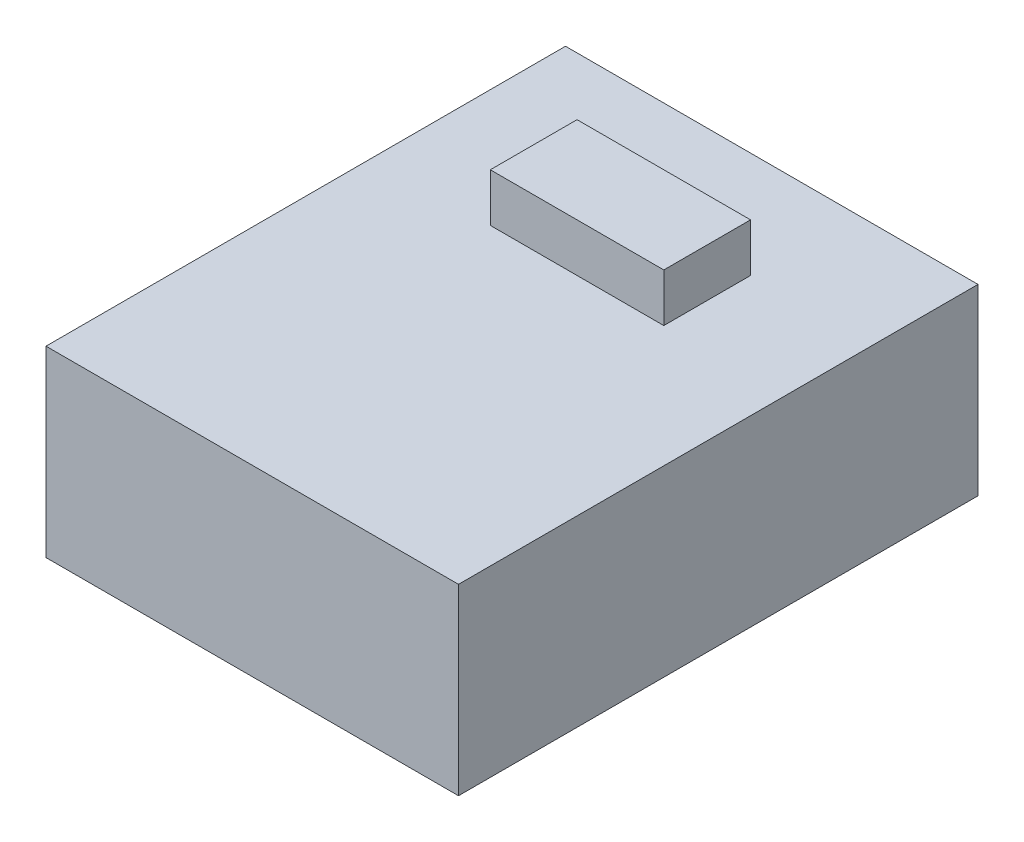
ISO-10303-21;
HEADER;
FILE_DESCRIPTION(('STEP AP214'),'2;1');
FILE_NAME('part.step','',(''),(''),'','','');
FILE_SCHEMA(('AUTOMOTIVE_DESIGN { 1 0 10303 214 1 1 1 1 }'));
ENDSEC;
DATA;
#1=APPLICATION_CONTEXT('core data for automotive mechanical design processes');
#2=APPLICATION_PROTOCOL_DEFINITION('international standard','automotive_design',2000,#1);
#3=PRODUCT_CONTEXT('',#1,'mechanical');
#4=PRODUCT('Part','Part','',(#3));
#5=PRODUCT_RELATED_PRODUCT_CATEGORY('part','',(#4));
#6=PRODUCT_DEFINITION_FORMATION('','',#4);
#7=PRODUCT_DEFINITION_CONTEXT('part definition',#1,'design');
#8=PRODUCT_DEFINITION('design','',#6,#7);
#9=PRODUCT_DEFINITION_SHAPE('','',#8);
#10=(LENGTH_UNIT() NAMED_UNIT(*) SI_UNIT(.MILLI.,.METRE.));
#11=(NAMED_UNIT(*) PLANE_ANGLE_UNIT() SI_UNIT($,.RADIAN.));
#12=(NAMED_UNIT(*) SI_UNIT($,.STERADIAN.) SOLID_ANGLE_UNIT());
#13=UNCERTAINTY_MEASURE_WITH_UNIT(LENGTH_MEASURE(1.E-05),#10,'distance_accuracy_value','');
#14=(GEOMETRIC_REPRESENTATION_CONTEXT(3) GLOBAL_UNCERTAINTY_ASSIGNED_CONTEXT((#13)) GLOBAL_UNIT_ASSIGNED_CONTEXT((#10,
#11,#12)) REPRESENTATION_CONTEXT('',''));
#15=CARTESIAN_POINT('',(0.,0.,0.));
#16=DIRECTION('',(0.,0.,1.));
#17=DIRECTION('',(1.,0.,0.));
#18=AXIS2_PLACEMENT_3D('',#15,#16,#17);
#19=CARTESIAN_POINT('',(0.,19.,0.));
#20=DIRECTION('',(0.,-1.,0.));
#21=DIRECTION('',(0.,0.,-1.));
#22=AXIS2_PLACEMENT_3D('',#19,#20,#21);
#23=PLANE('',#22);
#24=DIRECTION('',(0.,0.,1.));
#25=VECTOR('',#24,1.);
#26=CARTESIAN_POINT('',(0.,19.,0.));
#27=LINE('',#26,#25);
#28=CARTESIAN_POINT('',(0.,19.,-53.9));
#29=VERTEX_POINT('',#28);
#30=CARTESIAN_POINT('',(0.,19.,0.));
#31=VERTEX_POINT('',#30);
#32=EDGE_CURVE('E129',#29,#31,#27,.T.);
#33=ORIENTED_EDGE('',*,*,#32,.T.);
#34=DIRECTION('',(1.,0.,0.));
#35=VECTOR('',#34,1.);
#36=CARTESIAN_POINT('',(0.,19.,0.));
#37=LINE('',#36,#35);
#38=CARTESIAN_POINT('',(42.8,19.,0.));
#39=VERTEX_POINT('',#38);
#40=EDGE_CURVE('E132',#31,#39,#37,.T.);
#41=ORIENTED_EDGE('',*,*,#40,.T.);
#42=DIRECTION('',(0.,0.,-1.));
#43=VECTOR('',#42,1.);
#44=CARTESIAN_POINT('',(42.8,19.,0.));
#45=LINE('',#44,#43);
#46=CARTESIAN_POINT('',(42.8,19.,-53.9));
#47=VERTEX_POINT('',#46);
#48=EDGE_CURVE('E135',#39,#47,#45,.T.);
#49=ORIENTED_EDGE('',*,*,#48,.T.);
#50=DIRECTION('',(-1.,0.,0.));
#51=VECTOR('',#50,1.);
#52=CARTESIAN_POINT('',(0.,19.,-53.9));
#53=LINE('',#52,#51);
#54=EDGE_CURVE('E137',#47,#29,#53,.T.);
#55=ORIENTED_EDGE('',*,*,#54,.T.);
#56=EDGE_LOOP('',(#33,#41,#49,#55));
#57=FACE_BOUND('',#56,.T.);
#58=DIRECTION('',(0.,0.,1.));
#59=VECTOR('',#58,1.);
#60=CARTESIAN_POINT('',(12.2,19.,-42.9));
#61=LINE('',#60,#59);
#62=CARTESIAN_POINT('',(12.2,19.,-42.9));
#63=VERTEX_POINT('',#62);
#64=CARTESIAN_POINT('',(12.2,19.,-33.9));
#65=VERTEX_POINT('',#64);
#66=EDGE_CURVE('E119',#63,#65,#61,.T.);
#67=ORIENTED_EDGE('',*,*,#66,.F.);
#68=DIRECTION('',(-1.,0.,0.));
#69=VECTOR('',#68,1.);
#70=CARTESIAN_POINT('',(12.2,19.,-42.9));
#71=LINE('',#70,#69);
#72=CARTESIAN_POINT('',(30.2,19.,-42.9));
#73=VERTEX_POINT('',#72);
#74=EDGE_CURVE('E116',#73,#63,#71,.T.);
#75=ORIENTED_EDGE('',*,*,#74,.F.);
#76=DIRECTION('',(0.,0.,-1.));
#77=VECTOR('',#76,1.);
#78=CARTESIAN_POINT('',(30.2,19.,-42.9));
#79=LINE('',#78,#77);
#80=CARTESIAN_POINT('',(30.2,19.,-33.9));
#81=VERTEX_POINT('',#80);
#82=EDGE_CURVE('E54',#81,#73,#79,.T.);
#83=ORIENTED_EDGE('',*,*,#82,.F.);
#84=DIRECTION('',(1.,0.,0.));
#85=VECTOR('',#84,1.);
#86=CARTESIAN_POINT('',(12.2,19.,-33.9));
#87=LINE('',#86,#85);
#88=EDGE_CURVE('E49',#65,#81,#87,.T.);
#89=ORIENTED_EDGE('',*,*,#88,.F.);
#90=EDGE_LOOP('',(#67,#75,#83,#89));
#91=FACE_BOUND('',#90,.T.);
#92=ADVANCED_FACE('F34',(#57,#91),#23,.F.);
#93=CARTESIAN_POINT('',(0.,19.,0.));
#94=DIRECTION('',(1.,0.,0.));
#95=DIRECTION('',(0.,0.,-1.));
#96=AXIS2_PLACEMENT_3D('',#93,#94,#95);
#97=PLANE('',#96);
#98=DIRECTION('',(0.,0.,1.));
#99=VECTOR('',#98,1.);
#100=CARTESIAN_POINT('',(0.,0.,0.));
#101=LINE('',#100,#99);
#102=CARTESIAN_POINT('',(0.,0.,-53.9));
#103=VERTEX_POINT('',#102);
#104=CARTESIAN_POINT('',(0.,0.,0.));
#105=VERTEX_POINT('',#104);
#106=EDGE_CURVE('E120',#103,#105,#101,.T.);
#107=ORIENTED_EDGE('',*,*,#106,.T.);
#108=DIRECTION('',(0.,-1.,0.));
#109=VECTOR('',#108,1.);
#110=CARTESIAN_POINT('',(0.,19.,0.));
#111=LINE('',#110,#109);
#112=EDGE_CURVE('E11',#31,#105,#111,.T.);
#113=ORIENTED_EDGE('',*,*,#112,.F.);
#114=ORIENTED_EDGE('',*,*,#32,.F.);
#115=DIRECTION('',(0.,-1.,0.));
#116=VECTOR('',#115,1.);
#117=CARTESIAN_POINT('',(0.,19.,-53.9));
#118=LINE('',#117,#116);
#119=EDGE_CURVE('E138',#29,#103,#118,.T.);
#120=ORIENTED_EDGE('',*,*,#119,.T.);
#121=EDGE_LOOP('',(#107,#113,#114,#120));
#122=FACE_BOUND('',#121,.T.);
#123=ADVANCED_FACE('F36',(#122),#97,.F.);
#124=CARTESIAN_POINT('',(0.,19.,0.));
#125=DIRECTION('',(0.,0.,-1.));
#126=DIRECTION('',(-1.,0.,0.));
#127=AXIS2_PLACEMENT_3D('',#124,#125,#126);
#128=PLANE('',#127);
#129=DIRECTION('',(1.,0.,0.));
#130=VECTOR('',#129,1.);
#131=CARTESIAN_POINT('',(0.,0.,0.));
#132=LINE('',#131,#130);
#133=CARTESIAN_POINT('',(42.8,0.,0.));
#134=VERTEX_POINT('',#133);
#135=EDGE_CURVE('E123',#105,#134,#132,.T.);
#136=ORIENTED_EDGE('',*,*,#135,.T.);
#137=DIRECTION('',(0.,-1.,0.));
#138=VECTOR('',#137,1.);
#139=CARTESIAN_POINT('',(42.8,19.,0.));
#140=LINE('',#139,#138);
#141=EDGE_CURVE('E42',#39,#134,#140,.T.);
#142=ORIENTED_EDGE('',*,*,#141,.F.);
#143=ORIENTED_EDGE('',*,*,#40,.F.);
#144=ORIENTED_EDGE('',*,*,#112,.T.);
#145=EDGE_LOOP('',(#136,#142,#143,#144));
#146=FACE_BOUND('',#145,.T.);
#147=ADVANCED_FACE('F168',(#146),#128,.F.);
#148=CARTESIAN_POINT('',(42.8,19.,0.));
#149=DIRECTION('',(-1.,0.,0.));
#150=DIRECTION('',(0.,0.,1.));
#151=AXIS2_PLACEMENT_3D('',#148,#149,#150);
#152=PLANE('',#151);
#153=DIRECTION('',(0.,0.,-1.));
#154=VECTOR('',#153,1.);
#155=CARTESIAN_POINT('',(42.8,0.,0.));
#156=LINE('',#155,#154);
#157=CARTESIAN_POINT('',(42.8,0.,-53.9));
#158=VERTEX_POINT('',#157);
#159=EDGE_CURVE('E141',#134,#158,#156,.T.);
#160=ORIENTED_EDGE('',*,*,#159,.T.);
#161=DIRECTION('',(0.,-1.,0.));
#162=VECTOR('',#161,1.);
#163=CARTESIAN_POINT('',(42.8,19.,-53.9));
#164=LINE('',#163,#162);
#165=EDGE_CURVE('E146',#47,#158,#164,.T.);
#166=ORIENTED_EDGE('',*,*,#165,.F.);
#167=ORIENTED_EDGE('',*,*,#48,.F.);
#168=ORIENTED_EDGE('',*,*,#141,.T.);
#169=EDGE_LOOP('',(#160,#166,#167,#168));
#170=FACE_BOUND('',#169,.T.);
#171=ADVANCED_FACE('F153',(#170),#152,.F.);
#172=CARTESIAN_POINT('',(0.,19.,-53.9));
#173=DIRECTION('',(0.,0.,1.));
#174=DIRECTION('',(1.,0.,0.));
#175=AXIS2_PLACEMENT_3D('',#172,#173,#174);
#176=PLANE('',#175);
#177=DIRECTION('',(-1.,0.,0.));
#178=VECTOR('',#177,1.);
#179=CARTESIAN_POINT('',(0.,0.,-53.9));
#180=LINE('',#179,#178);
#181=EDGE_CURVE('E133',#158,#103,#180,.T.);
#182=ORIENTED_EDGE('',*,*,#181,.T.);
#183=ORIENTED_EDGE('',*,*,#119,.F.);
#184=ORIENTED_EDGE('',*,*,#54,.F.);
#185=ORIENTED_EDGE('',*,*,#165,.T.);
#186=EDGE_LOOP('',(#182,#183,#184,#185));
#187=FACE_BOUND('',#186,.T.);
#188=ADVANCED_FACE('F162',(#187),#176,.F.);
#189=CARTESIAN_POINT('',(0.,0.,0.));
#190=DIRECTION('',(0.,-1.,0.));
#191=DIRECTION('',(0.,0.,-1.));
#192=AXIS2_PLACEMENT_3D('',#189,#190,#191);
#193=PLANE('',#192);
#194=ORIENTED_EDGE('',*,*,#106,.F.);
#195=ORIENTED_EDGE('',*,*,#181,.F.);
#196=ORIENTED_EDGE('',*,*,#159,.F.);
#197=ORIENTED_EDGE('',*,*,#135,.F.);
#198=EDGE_LOOP('',(#194,#195,#196,#197));
#199=FACE_BOUND('',#198,.T.);
#200=ADVANCED_FACE('F159',(#199),#193,.T.);
#201=CARTESIAN_POINT('',(12.2,24.,-42.9));
#202=DIRECTION('',(1.,0.,0.));
#203=DIRECTION('',(0.,0.,-1.));
#204=AXIS2_PLACEMENT_3D('',#201,#202,#203);
#205=PLANE('',#204);
#206=ORIENTED_EDGE('',*,*,#66,.T.);
#207=DIRECTION('',(0.,-1.,0.));
#208=VECTOR('',#207,1.);
#209=CARTESIAN_POINT('',(12.2,24.,-33.9));
#210=LINE('',#209,#208);
#211=CARTESIAN_POINT('',(12.2,24.,-33.9));
#212=VERTEX_POINT('',#211);
#213=EDGE_CURVE('E100',#212,#65,#210,.T.);
#214=ORIENTED_EDGE('',*,*,#213,.F.);
#215=DIRECTION('',(0.,0.,1.));
#216=VECTOR('',#215,1.);
#217=CARTESIAN_POINT('',(12.2,24.,-42.9));
#218=LINE('',#217,#216);
#219=CARTESIAN_POINT('',(12.2,24.,-42.9));
#220=VERTEX_POINT('',#219);
#221=EDGE_CURVE('E107',#220,#212,#218,.T.);
#222=ORIENTED_EDGE('',*,*,#221,.F.);
#223=DIRECTION('',(0.,-1.,0.));
#224=VECTOR('',#223,1.);
#225=CARTESIAN_POINT('',(12.2,24.,-42.9));
#226=LINE('',#225,#224);
#227=EDGE_CURVE('E263',#220,#63,#226,.T.);
#228=ORIENTED_EDGE('',*,*,#227,.T.);
#229=EDGE_LOOP('',(#206,#214,#222,#228));
#230=FACE_BOUND('',#229,.T.);
#231=ADVANCED_FACE('F118',(#230),#205,.F.);
#232=CARTESIAN_POINT('',(12.2,24.,-33.9));
#233=DIRECTION('',(0.,0.,-1.));
#234=DIRECTION('',(-1.,0.,0.));
#235=AXIS2_PLACEMENT_3D('',#232,#233,#234);
#236=PLANE('',#235);
#237=ORIENTED_EDGE('',*,*,#88,.T.);
#238=DIRECTION('',(0.,-1.,0.));
#239=VECTOR('',#238,1.);
#240=CARTESIAN_POINT('',(30.2,24.,-33.9));
#241=LINE('',#240,#239);
#242=CARTESIAN_POINT('',(30.2,24.,-33.9));
#243=VERTEX_POINT('',#242);
#244=EDGE_CURVE('E103',#243,#81,#241,.T.);
#245=ORIENTED_EDGE('',*,*,#244,.F.);
#246=DIRECTION('',(1.,0.,0.));
#247=VECTOR('',#246,1.);
#248=CARTESIAN_POINT('',(12.2,24.,-33.9));
#249=LINE('',#248,#247);
#250=EDGE_CURVE('E96',#212,#243,#249,.T.);
#251=ORIENTED_EDGE('',*,*,#250,.F.);
#252=ORIENTED_EDGE('',*,*,#213,.T.);
#253=EDGE_LOOP('',(#237,#245,#251,#252));
#254=FACE_BOUND('',#253,.T.);
#255=ADVANCED_FACE('F98',(#254),#236,.F.);
#256=CARTESIAN_POINT('',(30.2,24.,-42.9));
#257=DIRECTION('',(-1.,0.,0.));
#258=DIRECTION('',(0.,0.,1.));
#259=AXIS2_PLACEMENT_3D('',#256,#257,#258);
#260=PLANE('',#259);
#261=ORIENTED_EDGE('',*,*,#82,.T.);
#262=DIRECTION('',(0.,-1.,0.));
#263=VECTOR('',#262,1.);
#264=CARTESIAN_POINT('',(30.2,24.,-42.9));
#265=LINE('',#264,#263);
#266=CARTESIAN_POINT('',(30.2,24.,-42.9));
#267=VERTEX_POINT('',#266);
#268=EDGE_CURVE('E125',#267,#73,#265,.T.);
#269=ORIENTED_EDGE('',*,*,#268,.F.);
#270=DIRECTION('',(0.,0.,-1.));
#271=VECTOR('',#270,1.);
#272=CARTESIAN_POINT('',(30.2,24.,-42.9));
#273=LINE('',#272,#271);
#274=EDGE_CURVE('E106',#243,#267,#273,.T.);
#275=ORIENTED_EDGE('',*,*,#274,.F.);
#276=ORIENTED_EDGE('',*,*,#244,.T.);
#277=EDGE_LOOP('',(#261,#269,#275,#276));
#278=FACE_BOUND('',#277,.T.);
#279=ADVANCED_FACE('F205',(#278),#260,.F.);
#280=CARTESIAN_POINT('',(12.2,24.,-42.9));
#281=DIRECTION('',(0.,0.,1.));
#282=DIRECTION('',(1.,0.,0.));
#283=AXIS2_PLACEMENT_3D('',#280,#281,#282);
#284=PLANE('',#283);
#285=ORIENTED_EDGE('',*,*,#74,.T.);
#286=ORIENTED_EDGE('',*,*,#227,.F.);
#287=DIRECTION('',(-1.,0.,0.));
#288=VECTOR('',#287,1.);
#289=CARTESIAN_POINT('',(12.2,24.,-42.9));
#290=LINE('',#289,#288);
#291=EDGE_CURVE('E112',#267,#220,#290,.T.);
#292=ORIENTED_EDGE('',*,*,#291,.F.);
#293=ORIENTED_EDGE('',*,*,#268,.T.);
#294=EDGE_LOOP('',(#285,#286,#292,#293));
#295=FACE_BOUND('',#294,.T.);
#296=ADVANCED_FACE('F211',(#295),#284,.F.);
#297=CARTESIAN_POINT('',(0.,24.,0.));
#298=DIRECTION('',(0.,1.,0.));
#299=DIRECTION('',(0.,0.,1.));
#300=AXIS2_PLACEMENT_3D('',#297,#298,#299);
#301=PLANE('',#300);
#302=ORIENTED_EDGE('',*,*,#221,.T.);
#303=ORIENTED_EDGE('',*,*,#250,.T.);
#304=ORIENTED_EDGE('',*,*,#274,.T.);
#305=ORIENTED_EDGE('',*,*,#291,.T.);
#306=EDGE_LOOP('',(#302,#303,#304,#305));
#307=FACE_BOUND('',#306,.T.);
#308=ADVANCED_FACE('F110',(#307),#301,.T.);
#309=CLOSED_SHELL('',(#92,#123,#147,#171,#188,#200,#231,#255,#279,#296,#308));
#310=MANIFOLD_SOLID_BREP('B2',#309);
#311=ADVANCED_BREP_SHAPE_REPRESENTATION('',(#18,#310),#14);
#312=SHAPE_DEFINITION_REPRESENTATION(#9,#311);
ENDSEC;
END-ISO-10303-21;
